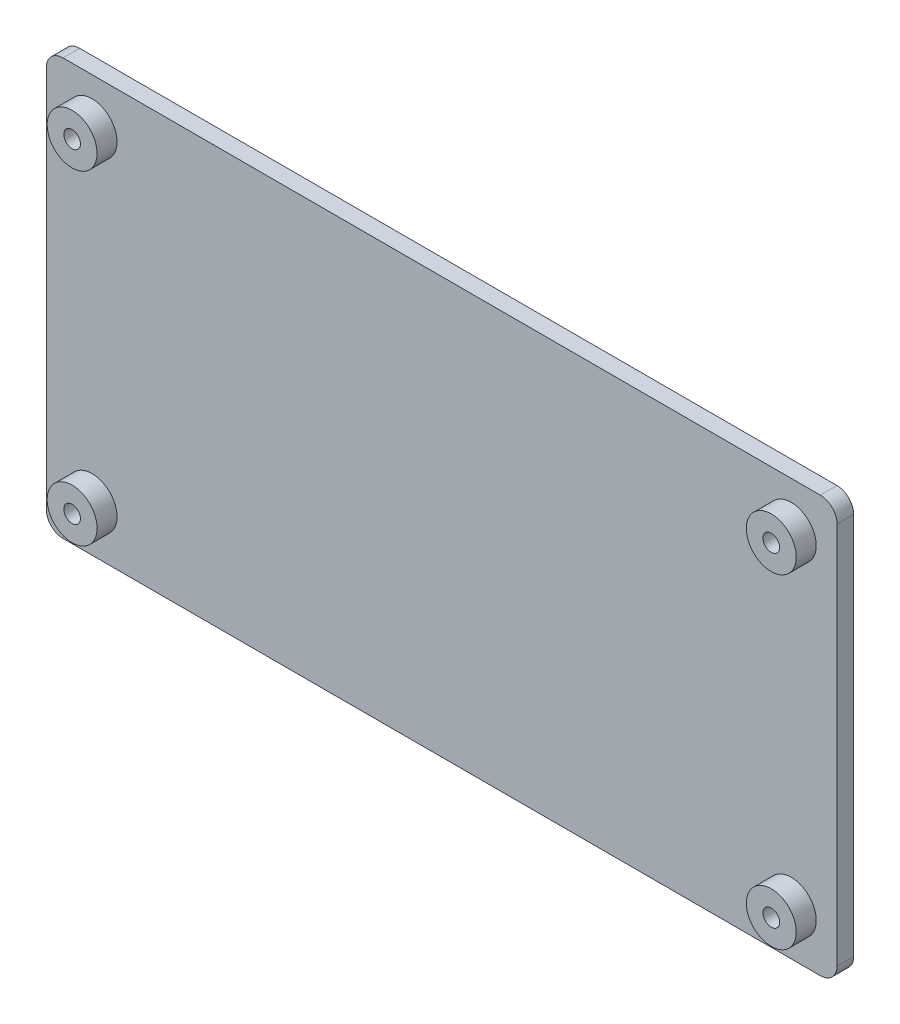
ISO-10303-21;
HEADER;
FILE_DESCRIPTION(('STEP AP214'),'2;1');
FILE_NAME('part.step','',(''),(''),'','','');
FILE_SCHEMA(('AUTOMOTIVE_DESIGN { 1 0 10303 214 1 1 1 1 }'));
ENDSEC;
DATA;
#1=APPLICATION_CONTEXT('core data for automotive mechanical design processes');
#2=APPLICATION_PROTOCOL_DEFINITION('international standard','automotive_design',2000,#1);
#3=PRODUCT_CONTEXT('',#1,'mechanical');
#4=PRODUCT('Part','Part','',(#3));
#5=PRODUCT_RELATED_PRODUCT_CATEGORY('part','',(#4));
#6=PRODUCT_DEFINITION_FORMATION('','',#4);
#7=PRODUCT_DEFINITION_CONTEXT('part definition',#1,'design');
#8=PRODUCT_DEFINITION('design','',#6,#7);
#9=PRODUCT_DEFINITION_SHAPE('','',#8);
#10=(LENGTH_UNIT() NAMED_UNIT(*) SI_UNIT(.MILLI.,.METRE.));
#11=(NAMED_UNIT(*) PLANE_ANGLE_UNIT() SI_UNIT($,.RADIAN.));
#12=(NAMED_UNIT(*) SI_UNIT($,.STERADIAN.) SOLID_ANGLE_UNIT());
#13=UNCERTAINTY_MEASURE_WITH_UNIT(LENGTH_MEASURE(1.E-05),#10,'distance_accuracy_value','');
#14=(GEOMETRIC_REPRESENTATION_CONTEXT(3) GLOBAL_UNCERTAINTY_ASSIGNED_CONTEXT((#13)) GLOBAL_UNIT_ASSIGNED_CONTEXT((#10,
#11,#12)) REPRESENTATION_CONTEXT('',''));
#15=CARTESIAN_POINT('',(0.,0.,0.));
#16=DIRECTION('',(0.,0.,1.));
#17=DIRECTION('',(1.,0.,0.));
#18=AXIS2_PLACEMENT_3D('',#15,#16,#17);
#19=CARTESIAN_POINT('',(47.5,-25.,2.));
#20=DIRECTION('',(-1.,0.,0.));
#21=DIRECTION('',(0.,0.,1.));
#22=AXIS2_PLACEMENT_3D('',#19,#20,#21);
#23=PLANE('',#22);
#24=DIRECTION('',(0.,1.,0.));
#25=VECTOR('',#24,1.);
#26=CARTESIAN_POINT('',(47.5,-25.,2.));
#27=LINE('',#26,#25);
#28=CARTESIAN_POINT('',(47.5,-23.,2.));
#29=VERTEX_POINT('',#28);
#30=CARTESIAN_POINT('',(47.5,23.,2.));
#31=VERTEX_POINT('',#30);
#32=EDGE_CURVE('E134',#29,#31,#27,.T.);
#33=ORIENTED_EDGE('',*,*,#32,.F.);
#34=DIRECTION('',(0.,0.,-1.));
#35=VECTOR('',#34,1.);
#36=CARTESIAN_POINT('',(47.5,-23.,2.));
#37=LINE('',#36,#35);
#38=CARTESIAN_POINT('',(47.5,-23.,0.));
#39=VERTEX_POINT('',#38);
#40=EDGE_CURVE('E114',#29,#39,#37,.T.);
#41=ORIENTED_EDGE('',*,*,#40,.T.);
#42=DIRECTION('',(0.,1.,0.));
#43=VECTOR('',#42,1.);
#44=CARTESIAN_POINT('',(47.5,-25.,0.));
#45=LINE('',#44,#43);
#46=CARTESIAN_POINT('',(47.5,23.,0.));
#47=VERTEX_POINT('',#46);
#48=EDGE_CURVE('E129',#39,#47,#45,.T.);
#49=ORIENTED_EDGE('',*,*,#48,.T.);
#50=DIRECTION('',(0.,0.,-1.));
#51=VECTOR('',#50,1.);
#52=CARTESIAN_POINT('',(47.5,23.,2.));
#53=LINE('',#52,#51);
#54=EDGE_CURVE('E133',#47,#31,#53,.F.);
#55=ORIENTED_EDGE('',*,*,#54,.T.);
#56=EDGE_LOOP('',(#33,#41,#49,#55));
#57=FACE_BOUND('',#56,.T.);
#58=ADVANCED_FACE('F44',(#57),#23,.F.);
#59=CARTESIAN_POINT('',(-47.5,25.,2.));
#60=DIRECTION('',(0.,-1.,0.));
#61=DIRECTION('',(1.,0.,0.));
#62=AXIS2_PLACEMENT_3D('',#59,#60,#61);
#63=PLANE('',#62);
#64=DIRECTION('',(-1.,0.,0.));
#65=VECTOR('',#64,1.);
#66=CARTESIAN_POINT('',(-47.5,25.,2.));
#67=LINE('',#66,#65);
#68=CARTESIAN_POINT('',(45.5,25.,2.));
#69=VERTEX_POINT('',#68);
#70=CARTESIAN_POINT('',(-45.5,25.,2.));
#71=VERTEX_POINT('',#70);
#72=EDGE_CURVE('E224',#69,#71,#67,.T.);
#73=ORIENTED_EDGE('',*,*,#72,.F.);
#74=DIRECTION('',(0.,0.,-1.));
#75=VECTOR('',#74,1.);
#76=CARTESIAN_POINT('',(45.5,25.,2.));
#77=LINE('',#76,#75);
#78=CARTESIAN_POINT('',(45.5,25.,0.));
#79=VERTEX_POINT('',#78);
#80=EDGE_CURVE('E204',#69,#79,#77,.T.);
#81=ORIENTED_EDGE('',*,*,#80,.T.);
#82=DIRECTION('',(-1.,0.,0.));
#83=VECTOR('',#82,1.);
#84=CARTESIAN_POINT('',(-47.5,25.,0.));
#85=LINE('',#84,#83);
#86=CARTESIAN_POINT('',(-45.5,25.,0.));
#87=VERTEX_POINT('',#86);
#88=EDGE_CURVE('E138',#79,#87,#85,.T.);
#89=ORIENTED_EDGE('',*,*,#88,.T.);
#90=DIRECTION('',(0.,0.,-1.));
#91=VECTOR('',#90,1.);
#92=CARTESIAN_POINT('',(-45.5,25.,2.));
#93=LINE('',#92,#91);
#94=EDGE_CURVE('E205',#87,#71,#93,.F.);
#95=ORIENTED_EDGE('',*,*,#94,.T.);
#96=EDGE_LOOP('',(#73,#81,#89,#95));
#97=FACE_BOUND('',#96,.T.);
#98=ADVANCED_FACE('F323',(#97),#63,.F.);
#99=CARTESIAN_POINT('',(-47.5,-25.,2.));
#100=DIRECTION('',(1.,0.,0.));
#101=DIRECTION('',(0.,1.,0.));
#102=AXIS2_PLACEMENT_3D('',#99,#100,#101);
#103=PLANE('',#102);
#104=DIRECTION('',(0.,-1.,0.));
#105=VECTOR('',#104,1.);
#106=CARTESIAN_POINT('',(-47.5,-25.,0.));
#107=LINE('',#106,#105);
#108=CARTESIAN_POINT('',(-47.5,23.,0.));
#109=VERTEX_POINT('',#108);
#110=CARTESIAN_POINT('',(-47.5,-23.,0.));
#111=VERTEX_POINT('',#110);
#112=EDGE_CURVE('E143',#109,#111,#107,.T.);
#113=ORIENTED_EDGE('',*,*,#112,.T.);
#114=DIRECTION('',(0.,0.,-1.));
#115=VECTOR('',#114,1.);
#116=CARTESIAN_POINT('',(-47.5,-23.,2.));
#117=LINE('',#116,#115);
#118=CARTESIAN_POINT('',(-47.5,-23.,2.));
#119=VERTEX_POINT('',#118);
#120=EDGE_CURVE('E11',#111,#119,#117,.F.);
#121=ORIENTED_EDGE('',*,*,#120,.T.);
#122=DIRECTION('',(0.,-1.,0.));
#123=VECTOR('',#122,1.);
#124=CARTESIAN_POINT('',(-47.5,-25.,2.));
#125=LINE('',#124,#123);
#126=CARTESIAN_POINT('',(-47.5,23.,2.));
#127=VERTEX_POINT('',#126);
#128=EDGE_CURVE('E214',#127,#119,#125,.T.);
#129=ORIENTED_EDGE('',*,*,#128,.F.);
#130=DIRECTION('',(0.,0.,-1.));
#131=VECTOR('',#130,1.);
#132=CARTESIAN_POINT('',(-47.5,23.,2.));
#133=LINE('',#132,#131);
#134=EDGE_CURVE('E53',#127,#109,#133,.T.);
#135=ORIENTED_EDGE('',*,*,#134,.T.);
#136=EDGE_LOOP('',(#113,#121,#129,#135));
#137=FACE_BOUND('',#136,.T.);
#138=ADVANCED_FACE('F215',(#137),#103,.F.);
#139=CARTESIAN_POINT('',(-47.5,-25.,2.));
#140=DIRECTION('',(0.,1.,0.));
#141=DIRECTION('',(-1.,0.,0.));
#142=AXIS2_PLACEMENT_3D('',#139,#140,#141);
#143=PLANE('',#142);
#144=DIRECTION('',(1.,0.,0.));
#145=VECTOR('',#144,1.);
#146=CARTESIAN_POINT('',(-47.5,-25.,0.));
#147=LINE('',#146,#145);
#148=CARTESIAN_POINT('',(-45.5,-25.,0.));
#149=VERTEX_POINT('',#148);
#150=CARTESIAN_POINT('',(45.5,-25.,0.));
#151=VERTEX_POINT('',#150);
#152=EDGE_CURVE('E156',#149,#151,#147,.T.);
#153=ORIENTED_EDGE('',*,*,#152,.T.);
#154=DIRECTION('',(0.,0.,-1.));
#155=VECTOR('',#154,1.);
#156=CARTESIAN_POINT('',(45.5,-25.,2.));
#157=LINE('',#156,#155);
#158=CARTESIAN_POINT('',(45.5,-25.,2.));
#159=VERTEX_POINT('',#158);
#160=EDGE_CURVE('E116',#151,#159,#157,.F.);
#161=ORIENTED_EDGE('',*,*,#160,.T.);
#162=DIRECTION('',(1.,0.,0.));
#163=VECTOR('',#162,1.);
#164=CARTESIAN_POINT('',(-47.5,-25.,2.));
#165=LINE('',#164,#163);
#166=CARTESIAN_POINT('',(-45.5,-25.,2.));
#167=VERTEX_POINT('',#166);
#168=EDGE_CURVE('E154',#167,#159,#165,.T.);
#169=ORIENTED_EDGE('',*,*,#168,.F.);
#170=DIRECTION('',(0.,0.,-1.));
#171=VECTOR('',#170,1.);
#172=CARTESIAN_POINT('',(-45.5,-25.,2.));
#173=LINE('',#172,#171);
#174=EDGE_CURVE('E125',#167,#149,#173,.T.);
#175=ORIENTED_EDGE('',*,*,#174,.T.);
#176=EDGE_LOOP('',(#153,#161,#169,#175));
#177=FACE_BOUND('',#176,.T.);
#178=ADVANCED_FACE('F221',(#177),#143,.F.);
#179=CARTESIAN_POINT('',(0.,0.,2.));
#180=DIRECTION('',(0.,0.,-1.));
#181=DIRECTION('',(-1.,0.,0.));
#182=AXIS2_PLACEMENT_3D('',#179,#180,#181);
#183=PLANE('',#182);
#184=CARTESIAN_POINT('',(42.0000000000002,-19.4999999999997,2.));
#185=DIRECTION('',(0.,0.,-1.));
#186=DIRECTION('',(-1.,0.,0.));
#187=AXIS2_PLACEMENT_3D('',#184,#185,#186);
#188=CIRCLE('',#187,3.);
#189=CARTESIAN_POINT('',(39.0000000000002,-19.4999999999997,2.));
#190=VERTEX_POINT('',#189);
#191=EDGE_CURVE('E237',#190,#190,#188,.T.);
#192=ORIENTED_EDGE('',*,*,#191,.T.);
#193=EDGE_LOOP('',(#192));
#194=FACE_BOUND('',#193,.T.);
#195=CARTESIAN_POINT('',(-42.0002133604268,-19.4999999999997,2.));
#196=DIRECTION('',(0.,0.,-1.));
#197=DIRECTION('',(-1.,0.,0.));
#198=AXIS2_PLACEMENT_3D('',#195,#196,#197);
#199=CIRCLE('',#198,2.99999999999992);
#200=CARTESIAN_POINT('',(-45.0002133604268,-19.4999999999997,2.));
#201=VERTEX_POINT('',#200);
#202=EDGE_CURVE('E247',#201,#201,#199,.T.);
#203=ORIENTED_EDGE('',*,*,#202,.T.);
#204=EDGE_LOOP('',(#203));
#205=FACE_BOUND('',#204,.T.);
#206=CARTESIAN_POINT('',(-42.0002133604268,19.5000990601983,2.));
#207=DIRECTION('',(0.,0.,-1.));
#208=DIRECTION('',(-1.,0.,0.));
#209=AXIS2_PLACEMENT_3D('',#206,#207,#208);
#210=CIRCLE('',#209,3.);
#211=CARTESIAN_POINT('',(-45.0002133604268,19.5000990601983,2.));
#212=VERTEX_POINT('',#211);
#213=EDGE_CURVE('E231',#212,#212,#210,.T.);
#214=ORIENTED_EDGE('',*,*,#213,.T.);
#215=EDGE_LOOP('',(#214));
#216=FACE_BOUND('',#215,.T.);
#217=CARTESIAN_POINT('',(42.0000000000001,19.5000990601983,2.));
#218=DIRECTION('',(0.,0.,-1.));
#219=DIRECTION('',(-1.,0.,0.));
#220=AXIS2_PLACEMENT_3D('',#217,#218,#219);
#221=CIRCLE('',#220,2.99999999999993);
#222=CARTESIAN_POINT('',(39.0000000000002,19.5000990601983,2.));
#223=VERTEX_POINT('',#222);
#224=EDGE_CURVE('E149',#223,#223,#221,.T.);
#225=ORIENTED_EDGE('',*,*,#224,.T.);
#226=EDGE_LOOP('',(#225));
#227=FACE_BOUND('',#226,.T.);
#228=ORIENTED_EDGE('',*,*,#168,.T.);
#229=CARTESIAN_POINT('',(45.5,-23.,2.));
#230=DIRECTION('',(0.,0.,-1.));
#231=DIRECTION('',(-1.,0.,0.));
#232=AXIS2_PLACEMENT_3D('',#229,#230,#231);
#233=CIRCLE('',#232,2.);
#234=EDGE_CURVE('E198',#159,#29,#233,.F.);
#235=ORIENTED_EDGE('',*,*,#234,.T.);
#236=ORIENTED_EDGE('',*,*,#32,.T.);
#237=CARTESIAN_POINT('',(45.5,23.,2.));
#238=DIRECTION('',(0.,0.,-1.));
#239=DIRECTION('',(-1.,0.,0.));
#240=AXIS2_PLACEMENT_3D('',#237,#238,#239);
#241=CIRCLE('',#240,2.);
#242=EDGE_CURVE('E199',#31,#69,#241,.F.);
#243=ORIENTED_EDGE('',*,*,#242,.T.);
#244=ORIENTED_EDGE('',*,*,#72,.T.);
#245=CARTESIAN_POINT('',(-45.5,23.,2.));
#246=DIRECTION('',(0.,0.,-1.));
#247=DIRECTION('',(-1.,0.,0.));
#248=AXIS2_PLACEMENT_3D('',#245,#246,#247);
#249=CIRCLE('',#248,2.);
#250=EDGE_CURVE('E69',#71,#127,#249,.F.);
#251=ORIENTED_EDGE('',*,*,#250,.T.);
#252=ORIENTED_EDGE('',*,*,#128,.T.);
#253=CARTESIAN_POINT('',(-45.5,-23.,2.));
#254=DIRECTION('',(0.,0.,-1.));
#255=DIRECTION('',(-1.,0.,0.));
#256=AXIS2_PLACEMENT_3D('',#253,#254,#255);
#257=CIRCLE('',#256,2.);
#258=EDGE_CURVE('E194',#119,#167,#257,.F.);
#259=ORIENTED_EDGE('',*,*,#258,.T.);
#260=EDGE_LOOP('',(#228,#235,#236,#243,#244,#251,#252,#259));
#261=FACE_BOUND('',#260,.T.);
#262=ADVANCED_FACE('F348',(#194,#205,#216,#227,#261),#183,.F.);
#263=CARTESIAN_POINT('',(0.,0.,0.));
#264=DIRECTION('',(0.,0.,-1.));
#265=DIRECTION('',(-1.,0.,0.));
#266=AXIS2_PLACEMENT_3D('',#263,#264,#265);
#267=PLANE('',#266);
#268=CARTESIAN_POINT('',(42.0000000000002,-19.4999999999997,0.));
#269=DIRECTION('',(0.,0.,-1.));
#270=DIRECTION('',(-1.,0.,0.));
#271=AXIS2_PLACEMENT_3D('',#268,#269,#270);
#272=CIRCLE('',#271,2.);
#273=CARTESIAN_POINT('',(40.0000000000002,-19.4999999999997,0.));
#274=VERTEX_POINT('',#273);
#275=EDGE_CURVE('E265',#274,#274,#272,.T.);
#276=ORIENTED_EDGE('',*,*,#275,.F.);
#277=EDGE_LOOP('',(#276));
#278=FACE_BOUND('',#277,.T.);
#279=CARTESIAN_POINT('',(-42.0002133604268,19.5000990601983,0.));
#280=DIRECTION('',(0.,0.,-1.));
#281=DIRECTION('',(-1.,0.,0.));
#282=AXIS2_PLACEMENT_3D('',#279,#280,#281);
#283=CIRCLE('',#282,2.);
#284=CARTESIAN_POINT('',(-44.0002133604268,19.5000990601983,0.));
#285=VERTEX_POINT('',#284);
#286=EDGE_CURVE('E272',#285,#285,#283,.T.);
#287=ORIENTED_EDGE('',*,*,#286,.F.);
#288=EDGE_LOOP('',(#287));
#289=FACE_BOUND('',#288,.T.);
#290=CARTESIAN_POINT('',(-42.0002133604268,-19.4999999999997,0.));
#291=DIRECTION('',(0.,0.,-1.));
#292=DIRECTION('',(-1.,0.,0.));
#293=AXIS2_PLACEMENT_3D('',#290,#291,#292);
#294=CIRCLE('',#293,2.);
#295=CARTESIAN_POINT('',(-44.0002133604268,-19.4999999999997,0.));
#296=VERTEX_POINT('',#295);
#297=EDGE_CURVE('E275',#296,#296,#294,.T.);
#298=ORIENTED_EDGE('',*,*,#297,.F.);
#299=EDGE_LOOP('',(#298));
#300=FACE_BOUND('',#299,.T.);
#301=CARTESIAN_POINT('',(42.0000000000002,19.5000990601983,0.));
#302=DIRECTION('',(0.,0.,-1.));
#303=DIRECTION('',(-1.,0.,0.));
#304=AXIS2_PLACEMENT_3D('',#301,#302,#303);
#305=CIRCLE('',#304,2.);
#306=CARTESIAN_POINT('',(40.0000000000002,19.5000990601983,0.));
#307=VERTEX_POINT('',#306);
#308=EDGE_CURVE('E256',#307,#307,#305,.T.);
#309=ORIENTED_EDGE('',*,*,#308,.F.);
#310=EDGE_LOOP('',(#309));
#311=FACE_BOUND('',#310,.T.);
#312=ORIENTED_EDGE('',*,*,#48,.F.);
#313=CARTESIAN_POINT('',(45.5,-23.,0.));
#314=DIRECTION('',(0.,0.,-1.));
#315=DIRECTION('',(-1.,0.,0.));
#316=AXIS2_PLACEMENT_3D('',#313,#314,#315);
#317=CIRCLE('',#316,2.);
#318=EDGE_CURVE('E111',#39,#151,#317,.T.);
#319=ORIENTED_EDGE('',*,*,#318,.T.);
#320=ORIENTED_EDGE('',*,*,#152,.F.);
#321=CARTESIAN_POINT('',(-45.5,-23.,0.));
#322=DIRECTION('',(0.,0.,-1.));
#323=DIRECTION('',(-1.,0.,0.));
#324=AXIS2_PLACEMENT_3D('',#321,#322,#323);
#325=CIRCLE('',#324,2.);
#326=EDGE_CURVE('E181',#149,#111,#325,.T.);
#327=ORIENTED_EDGE('',*,*,#326,.T.);
#328=ORIENTED_EDGE('',*,*,#112,.F.);
#329=CARTESIAN_POINT('',(-45.5,23.,0.));
#330=DIRECTION('',(0.,0.,-1.));
#331=DIRECTION('',(-1.,0.,0.));
#332=AXIS2_PLACEMENT_3D('',#329,#330,#331);
#333=CIRCLE('',#332,2.);
#334=EDGE_CURVE('E135',#109,#87,#333,.T.);
#335=ORIENTED_EDGE('',*,*,#334,.T.);
#336=ORIENTED_EDGE('',*,*,#88,.F.);
#337=CARTESIAN_POINT('',(45.5,23.,0.));
#338=DIRECTION('',(0.,0.,-1.));
#339=DIRECTION('',(-1.,0.,0.));
#340=AXIS2_PLACEMENT_3D('',#337,#338,#339);
#341=CIRCLE('',#340,2.);
#342=EDGE_CURVE('E124',#79,#47,#341,.T.);
#343=ORIENTED_EDGE('',*,*,#342,.T.);
#344=EDGE_LOOP('',(#312,#319,#320,#327,#328,#335,#336,#343));
#345=FACE_BOUND('',#344,.T.);
#346=ADVANCED_FACE('F136',(#278,#289,#300,#311,#345),#267,.T.);
#347=CARTESIAN_POINT('',(42.0000000000001,19.5000990601983,4.4));
#348=DIRECTION('',(0.,0.,-1.));
#349=DIRECTION('',(-1.,0.,0.));
#350=AXIS2_PLACEMENT_3D('',#347,#348,#349);
#351=CYLINDRICAL_SURFACE('',#350,2.99999999999993);
#352=CARTESIAN_POINT('',(42.0000000000001,19.5000990601983,4.4));
#353=DIRECTION('',(0.,0.,-1.));
#354=DIRECTION('',(-1.,0.,0.));
#355=AXIS2_PLACEMENT_3D('',#352,#353,#354);
#356=CIRCLE('',#355,2.99999999999993);
#357=CARTESIAN_POINT('',(39.0000000000002,19.5000990601983,4.4));
#358=VERTEX_POINT('',#357);
#359=EDGE_CURVE('E139',#358,#358,#356,.T.);
#360=ORIENTED_EDGE('',*,*,#359,.T.);
#361=EDGE_LOOP('',(#360));
#362=FACE_BOUND('',#361,.T.);
#363=ORIENTED_EDGE('',*,*,#224,.F.);
#364=EDGE_LOOP('',(#363));
#365=FACE_BOUND('',#364,.T.);
#366=ADVANCED_FACE('F356',(#362,#365),#351,.T.);
#367=CARTESIAN_POINT('',(42.0000000000001,19.5000990601983,4.4));
#368=DIRECTION('',(0.,0.,-1.));
#369=DIRECTION('',(-1.,0.,0.));
#370=AXIS2_PLACEMENT_3D('',#367,#368,#369);
#371=PLANE('',#370);
#372=CARTESIAN_POINT('',(42.0000000000002,19.5000990601983,4.4));
#373=DIRECTION('',(0.,0.,-1.));
#374=DIRECTION('',(-1.,0.,0.));
#375=AXIS2_PLACEMENT_3D('',#372,#373,#374);
#376=CIRCLE('',#375,0.999999999999998);
#377=CARTESIAN_POINT('',(41.0000000000002,19.5000990601983,4.4));
#378=VERTEX_POINT('',#377);
#379=EDGE_CURVE('E165',#378,#378,#376,.T.);
#380=ORIENTED_EDGE('',*,*,#379,.T.);
#381=EDGE_LOOP('',(#380));
#382=FACE_BOUND('',#381,.T.);
#383=ORIENTED_EDGE('',*,*,#359,.F.);
#384=EDGE_LOOP('',(#383));
#385=FACE_BOUND('',#384,.T.);
#386=ADVANCED_FACE('F392',(#382,#385),#371,.F.);
#387=CARTESIAN_POINT('',(-42.0002133604268,19.5000990601983,4.4));
#388=DIRECTION('',(0.,0.,-1.));
#389=DIRECTION('',(-1.,0.,0.));
#390=AXIS2_PLACEMENT_3D('',#387,#388,#389);
#391=CYLINDRICAL_SURFACE('',#390,3.);
#392=CARTESIAN_POINT('',(-42.0002133604268,19.5000990601983,4.4));
#393=DIRECTION('',(0.,0.,-1.));
#394=DIRECTION('',(-1.,0.,0.));
#395=AXIS2_PLACEMENT_3D('',#392,#393,#394);
#396=CIRCLE('',#395,3.);
#397=CARTESIAN_POINT('',(-45.0002133604268,19.5000990601983,4.4));
#398=VERTEX_POINT('',#397);
#399=EDGE_CURVE('E255',#398,#398,#396,.T.);
#400=ORIENTED_EDGE('',*,*,#399,.T.);
#401=EDGE_LOOP('',(#400));
#402=FACE_BOUND('',#401,.T.);
#403=ORIENTED_EDGE('',*,*,#213,.F.);
#404=EDGE_LOOP('',(#403));
#405=FACE_BOUND('',#404,.T.);
#406=ADVANCED_FACE('F403',(#402,#405),#391,.T.);
#407=CARTESIAN_POINT('',(-42.0002133604268,19.5000990601983,4.4));
#408=DIRECTION('',(0.,0.,-1.));
#409=DIRECTION('',(-1.,0.,0.));
#410=AXIS2_PLACEMENT_3D('',#407,#408,#409);
#411=PLANE('',#410);
#412=CARTESIAN_POINT('',(-42.0002133604268,19.5000990601983,4.4));
#413=DIRECTION('',(0.,0.,-1.));
#414=DIRECTION('',(-1.,0.,0.));
#415=AXIS2_PLACEMENT_3D('',#412,#413,#414);
#416=CIRCLE('',#415,0.999999999999998);
#417=CARTESIAN_POINT('',(-43.0002133604268,19.5000990601983,4.4));
#418=VERTEX_POINT('',#417);
#419=EDGE_CURVE('E292',#418,#418,#416,.T.);
#420=ORIENTED_EDGE('',*,*,#419,.T.);
#421=EDGE_LOOP('',(#420));
#422=FACE_BOUND('',#421,.T.);
#423=ORIENTED_EDGE('',*,*,#399,.F.);
#424=EDGE_LOOP('',(#423));
#425=FACE_BOUND('',#424,.T.);
#426=ADVANCED_FACE('F304',(#422,#425),#411,.F.);
#427=CARTESIAN_POINT('',(-42.0002133604268,-19.4999999999997,4.4));
#428=DIRECTION('',(0.,0.,-1.));
#429=DIRECTION('',(-1.,0.,0.));
#430=AXIS2_PLACEMENT_3D('',#427,#428,#429);
#431=CYLINDRICAL_SURFACE('',#430,2.99999999999992);
#432=CARTESIAN_POINT('',(-42.0002133604268,-19.4999999999997,4.4));
#433=DIRECTION('',(0.,0.,-1.));
#434=DIRECTION('',(-1.,0.,0.));
#435=AXIS2_PLACEMENT_3D('',#432,#433,#434);
#436=CIRCLE('',#435,2.99999999999992);
#437=CARTESIAN_POINT('',(-45.0002133604268,-19.4999999999997,4.4));
#438=VERTEX_POINT('',#437);
#439=EDGE_CURVE('E242',#438,#438,#436,.T.);
#440=ORIENTED_EDGE('',*,*,#439,.T.);
#441=EDGE_LOOP('',(#440));
#442=FACE_BOUND('',#441,.T.);
#443=ORIENTED_EDGE('',*,*,#202,.F.);
#444=EDGE_LOOP('',(#443));
#445=FACE_BOUND('',#444,.T.);
#446=ADVANCED_FACE('F425',(#442,#445),#431,.T.);
#447=CARTESIAN_POINT('',(-42.0002133604268,-19.4999999999997,4.4));
#448=DIRECTION('',(0.,0.,-1.));
#449=DIRECTION('',(-1.,0.,0.));
#450=AXIS2_PLACEMENT_3D('',#447,#448,#449);
#451=PLANE('',#450);
#452=CARTESIAN_POINT('',(-42.0002133604268,-19.4999999999997,4.4));
#453=DIRECTION('',(0.,0.,-1.));
#454=DIRECTION('',(-1.,0.,0.));
#455=AXIS2_PLACEMENT_3D('',#452,#453,#454);
#456=CIRCLE('',#455,0.999999999999998);
#457=CARTESIAN_POINT('',(-43.0002133604268,-19.4999999999997,4.4));
#458=VERTEX_POINT('',#457);
#459=EDGE_CURVE('E300',#458,#458,#456,.T.);
#460=ORIENTED_EDGE('',*,*,#459,.T.);
#461=EDGE_LOOP('',(#460));
#462=FACE_BOUND('',#461,.T.);
#463=ORIENTED_EDGE('',*,*,#439,.F.);
#464=EDGE_LOOP('',(#463));
#465=FACE_BOUND('',#464,.T.);
#466=ADVANCED_FACE('F433',(#462,#465),#451,.F.);
#467=CARTESIAN_POINT('',(42.0000000000002,-19.4999999999997,4.4));
#468=DIRECTION('',(0.,0.,-1.));
#469=DIRECTION('',(-1.,0.,0.));
#470=AXIS2_PLACEMENT_3D('',#467,#468,#469);
#471=CYLINDRICAL_SURFACE('',#470,3.);
#472=CARTESIAN_POINT('',(42.0000000000002,-19.4999999999997,4.4));
#473=DIRECTION('',(0.,0.,-1.));
#474=DIRECTION('',(-1.,0.,0.));
#475=AXIS2_PLACEMENT_3D('',#472,#473,#474);
#476=CIRCLE('',#475,3.);
#477=CARTESIAN_POINT('',(39.0000000000002,-19.4999999999997,4.4));
#478=VERTEX_POINT('',#477);
#479=EDGE_CURVE('E232',#478,#478,#476,.T.);
#480=ORIENTED_EDGE('',*,*,#479,.T.);
#481=EDGE_LOOP('',(#480));
#482=FACE_BOUND('',#481,.T.);
#483=ORIENTED_EDGE('',*,*,#191,.F.);
#484=EDGE_LOOP('',(#483));
#485=FACE_BOUND('',#484,.T.);
#486=ADVANCED_FACE('F442',(#482,#485),#471,.T.);
#487=CARTESIAN_POINT('',(42.0000000000002,-19.4999999999997,4.4));
#488=DIRECTION('',(0.,0.,-1.));
#489=DIRECTION('',(-1.,0.,0.));
#490=AXIS2_PLACEMENT_3D('',#487,#488,#489);
#491=PLANE('',#490);
#492=CARTESIAN_POINT('',(42.0000000000002,-19.4999999999997,4.4));
#493=DIRECTION('',(0.,0.,-1.));
#494=DIRECTION('',(-1.,0.,0.));
#495=AXIS2_PLACEMENT_3D('',#492,#493,#494);
#496=CIRCLE('',#495,0.999999999999998);
#497=CARTESIAN_POINT('',(41.0000000000002,-19.4999999999997,4.4));
#498=VERTEX_POINT('',#497);
#499=EDGE_CURVE('E291',#498,#498,#496,.T.);
#500=ORIENTED_EDGE('',*,*,#499,.T.);
#501=EDGE_LOOP('',(#500));
#502=FACE_BOUND('',#501,.T.);
#503=ORIENTED_EDGE('',*,*,#479,.F.);
#504=EDGE_LOOP('',(#503));
#505=FACE_BOUND('',#504,.T.);
#506=ADVANCED_FACE('F454',(#502,#505),#491,.F.);
#507=CARTESIAN_POINT('',(42.0000000000002,19.5000990601983,1.5));
#508=DIRECTION('',(0.,0.,-1.));
#509=DIRECTION('',(-1.,0.,0.));
#510=AXIS2_PLACEMENT_3D('',#507,#508,#509);
#511=CYLINDRICAL_SURFACE('',#510,2.);
#512=CARTESIAN_POINT('',(42.0000000000002,19.5000990601983,1.5));
#513=DIRECTION('',(0.,0.,-1.));
#514=DIRECTION('',(-1.,0.,0.));
#515=AXIS2_PLACEMENT_3D('',#512,#513,#514);
#516=CIRCLE('',#515,2.);
#517=CARTESIAN_POINT('',(40.0000000000002,19.5000990601983,1.5));
#518=VERTEX_POINT('',#517);
#519=EDGE_CURVE('E239',#518,#518,#516,.T.);
#520=ORIENTED_EDGE('',*,*,#519,.F.);
#521=EDGE_LOOP('',(#520));
#522=FACE_BOUND('',#521,.T.);
#523=ORIENTED_EDGE('',*,*,#308,.T.);
#524=EDGE_LOOP('',(#523));
#525=FACE_BOUND('',#524,.T.);
#526=ADVANCED_FACE('F462',(#522,#525),#511,.F.);
#527=CARTESIAN_POINT('',(42.0000000000002,19.5000990601983,1.5));
#528=DIRECTION('',(0.,0.,-1.));
#529=DIRECTION('',(-1.,0.,0.));
#530=AXIS2_PLACEMENT_3D('',#527,#528,#529);
#531=PLANE('',#530);
#532=CARTESIAN_POINT('',(42.0000000000002,19.5000990601983,1.5));
#533=DIRECTION('',(0.,0.,-1.));
#534=DIRECTION('',(-1.,0.,0.));
#535=AXIS2_PLACEMENT_3D('',#532,#533,#534);
#536=CIRCLE('',#535,0.999999999999998);
#537=CARTESIAN_POINT('',(41.0000000000002,19.5000990601983,1.5));
#538=VERTEX_POINT('',#537);
#539=EDGE_CURVE('E175',#538,#538,#536,.T.);
#540=ORIENTED_EDGE('',*,*,#539,.F.);
#541=EDGE_LOOP('',(#540));
#542=FACE_BOUND('',#541,.T.);
#543=ORIENTED_EDGE('',*,*,#519,.T.);
#544=EDGE_LOOP('',(#543));
#545=FACE_BOUND('',#544,.T.);
#546=ADVANCED_FACE('F474',(#542,#545),#531,.T.);
#547=CARTESIAN_POINT('',(-42.0002133604268,-19.4999999999997,1.5));
#548=DIRECTION('',(0.,0.,-1.));
#549=DIRECTION('',(-1.,0.,0.));
#550=AXIS2_PLACEMENT_3D('',#547,#548,#549);
#551=CYLINDRICAL_SURFACE('',#550,2.);
#552=CARTESIAN_POINT('',(-42.0002133604268,-19.4999999999997,1.5));
#553=DIRECTION('',(0.,0.,-1.));
#554=DIRECTION('',(-1.,0.,0.));
#555=AXIS2_PLACEMENT_3D('',#552,#553,#554);
#556=CIRCLE('',#555,2.);
#557=CARTESIAN_POINT('',(-44.0002133604268,-19.4999999999997,1.5));
#558=VERTEX_POINT('',#557);
#559=EDGE_CURVE('E176',#558,#558,#556,.T.);
#560=ORIENTED_EDGE('',*,*,#559,.F.);
#561=EDGE_LOOP('',(#560));
#562=FACE_BOUND('',#561,.T.);
#563=ORIENTED_EDGE('',*,*,#297,.T.);
#564=EDGE_LOOP('',(#563));
#565=FACE_BOUND('',#564,.T.);
#566=ADVANCED_FACE('F482',(#562,#565),#551,.F.);
#567=CARTESIAN_POINT('',(-42.0002133604268,-19.4999999999997,1.5));
#568=DIRECTION('',(0.,0.,-1.));
#569=DIRECTION('',(-1.,0.,0.));
#570=AXIS2_PLACEMENT_3D('',#567,#568,#569);
#571=PLANE('',#570);
#572=CARTESIAN_POINT('',(-42.0002133604268,-19.4999999999997,1.5));
#573=DIRECTION('',(0.,0.,-1.));
#574=DIRECTION('',(-1.,0.,0.));
#575=AXIS2_PLACEMENT_3D('',#572,#573,#574);
#576=CIRCLE('',#575,0.999999999999998);
#577=CARTESIAN_POINT('',(-43.0002133604268,-19.4999999999997,1.5));
#578=VERTEX_POINT('',#577);
#579=EDGE_CURVE('E166',#578,#578,#576,.T.);
#580=ORIENTED_EDGE('',*,*,#579,.F.);
#581=EDGE_LOOP('',(#580));
#582=FACE_BOUND('',#581,.T.);
#583=ORIENTED_EDGE('',*,*,#559,.T.);
#584=EDGE_LOOP('',(#583));
#585=FACE_BOUND('',#584,.T.);
#586=ADVANCED_FACE('F491',(#582,#585),#571,.T.);
#587=CARTESIAN_POINT('',(-42.0002133604268,19.5000990601983,1.5));
#588=DIRECTION('',(0.,0.,-1.));
#589=DIRECTION('',(-1.,0.,0.));
#590=AXIS2_PLACEMENT_3D('',#587,#588,#589);
#591=CYLINDRICAL_SURFACE('',#590,2.);
#592=CARTESIAN_POINT('',(-42.0002133604268,19.5000990601983,1.5));
#593=DIRECTION('',(0.,0.,-1.));
#594=DIRECTION('',(-1.,0.,0.));
#595=AXIS2_PLACEMENT_3D('',#592,#593,#594);
#596=CIRCLE('',#595,2.);
#597=CARTESIAN_POINT('',(-44.0002133604268,19.5000990601983,1.5));
#598=VERTEX_POINT('',#597);
#599=EDGE_CURVE('E270',#598,#598,#596,.T.);
#600=ORIENTED_EDGE('',*,*,#599,.F.);
#601=EDGE_LOOP('',(#600));
#602=FACE_BOUND('',#601,.T.);
#603=ORIENTED_EDGE('',*,*,#286,.T.);
#604=EDGE_LOOP('',(#603));
#605=FACE_BOUND('',#604,.T.);
#606=ADVANCED_FACE('F503',(#602,#605),#591,.F.);
#607=CARTESIAN_POINT('',(-42.0002133604268,19.5000990601983,1.5));
#608=DIRECTION('',(0.,0.,-1.));
#609=DIRECTION('',(-1.,0.,0.));
#610=AXIS2_PLACEMENT_3D('',#607,#608,#609);
#611=PLANE('',#610);
#612=CARTESIAN_POINT('',(-42.0002133604268,19.5000990601983,1.5));
#613=DIRECTION('',(0.,0.,-1.));
#614=DIRECTION('',(-1.,0.,0.));
#615=AXIS2_PLACEMENT_3D('',#612,#613,#614);
#616=CIRCLE('',#615,0.999999999999998);
#617=CARTESIAN_POINT('',(-43.0002133604268,19.5000990601983,1.5));
#618=VERTEX_POINT('',#617);
#619=EDGE_CURVE('E161',#618,#618,#616,.T.);
#620=ORIENTED_EDGE('',*,*,#619,.F.);
#621=EDGE_LOOP('',(#620));
#622=FACE_BOUND('',#621,.T.);
#623=ORIENTED_EDGE('',*,*,#599,.T.);
#624=EDGE_LOOP('',(#623));
#625=FACE_BOUND('',#624,.T.);
#626=ADVANCED_FACE('F514',(#622,#625),#611,.T.);
#627=CARTESIAN_POINT('',(42.0000000000002,-19.4999999999997,1.5));
#628=DIRECTION('',(0.,0.,-1.));
#629=DIRECTION('',(-1.,0.,0.));
#630=AXIS2_PLACEMENT_3D('',#627,#628,#629);
#631=CYLINDRICAL_SURFACE('',#630,2.);
#632=CARTESIAN_POINT('',(42.0000000000002,-19.4999999999997,1.5));
#633=DIRECTION('',(0.,0.,-1.));
#634=DIRECTION('',(-1.,0.,0.));
#635=AXIS2_PLACEMENT_3D('',#632,#633,#634);
#636=CIRCLE('',#635,2.);
#637=CARTESIAN_POINT('',(40.0000000000002,-19.4999999999997,1.5));
#638=VERTEX_POINT('',#637);
#639=EDGE_CURVE('E277',#638,#638,#636,.T.);
#640=ORIENTED_EDGE('',*,*,#639,.F.);
#641=EDGE_LOOP('',(#640));
#642=FACE_BOUND('',#641,.T.);
#643=ORIENTED_EDGE('',*,*,#275,.T.);
#644=EDGE_LOOP('',(#643));
#645=FACE_BOUND('',#644,.T.);
#646=ADVANCED_FACE('F521',(#642,#645),#631,.F.);
#647=CARTESIAN_POINT('',(42.0000000000002,-19.4999999999997,1.5));
#648=DIRECTION('',(0.,0.,-1.));
#649=DIRECTION('',(-1.,0.,0.));
#650=AXIS2_PLACEMENT_3D('',#647,#648,#649);
#651=PLANE('',#650);
#652=CARTESIAN_POINT('',(42.0000000000002,-19.4999999999997,1.5));
#653=DIRECTION('',(0.,0.,-1.));
#654=DIRECTION('',(-1.,0.,0.));
#655=AXIS2_PLACEMENT_3D('',#652,#653,#654);
#656=CIRCLE('',#655,0.999999999999998);
#657=CARTESIAN_POINT('',(41.0000000000002,-19.4999999999997,1.5));
#658=VERTEX_POINT('',#657);
#659=EDGE_CURVE('E158',#658,#658,#656,.T.);
#660=ORIENTED_EDGE('',*,*,#659,.F.);
#661=EDGE_LOOP('',(#660));
#662=FACE_BOUND('',#661,.T.);
#663=ORIENTED_EDGE('',*,*,#639,.T.);
#664=EDGE_LOOP('',(#663));
#665=FACE_BOUND('',#664,.T.);
#666=ADVANCED_FACE('F322',(#662,#665),#651,.T.);
#667=CARTESIAN_POINT('',(42.0000000000002,-19.4999999999997,4.4));
#668=DIRECTION('',(0.,0.,-1.));
#669=DIRECTION('',(-1.,0.,0.));
#670=AXIS2_PLACEMENT_3D('',#667,#668,#669);
#671=CYLINDRICAL_SURFACE('',#670,0.999999999999998);
#672=ORIENTED_EDGE('',*,*,#659,.T.);
#673=EDGE_LOOP('',(#672));
#674=FACE_BOUND('',#673,.T.);
#675=ORIENTED_EDGE('',*,*,#499,.F.);
#676=EDGE_LOOP('',(#675));
#677=FACE_BOUND('',#676,.T.);
#678=ADVANCED_FACE('F311',(#674,#677),#671,.F.);
#679=CARTESIAN_POINT('',(-42.0002133604268,19.5000990601983,4.4));
#680=DIRECTION('',(0.,0.,-1.));
#681=DIRECTION('',(-1.,0.,0.));
#682=AXIS2_PLACEMENT_3D('',#679,#680,#681);
#683=CYLINDRICAL_SURFACE('',#682,0.999999999999998);
#684=ORIENTED_EDGE('',*,*,#619,.T.);
#685=EDGE_LOOP('',(#684));
#686=FACE_BOUND('',#685,.T.);
#687=ORIENTED_EDGE('',*,*,#419,.F.);
#688=EDGE_LOOP('',(#687));
#689=FACE_BOUND('',#688,.T.);
#690=ADVANCED_FACE('F308',(#686,#689),#683,.F.);
#691=CARTESIAN_POINT('',(-42.0002133604268,-19.4999999999997,4.4));
#692=DIRECTION('',(0.,0.,-1.));
#693=DIRECTION('',(-1.,0.,0.));
#694=AXIS2_PLACEMENT_3D('',#691,#692,#693);
#695=CYLINDRICAL_SURFACE('',#694,0.999999999999998);
#696=ORIENTED_EDGE('',*,*,#579,.T.);
#697=EDGE_LOOP('',(#696));
#698=FACE_BOUND('',#697,.T.);
#699=ORIENTED_EDGE('',*,*,#459,.F.);
#700=EDGE_LOOP('',(#699));
#701=FACE_BOUND('',#700,.T.);
#702=ADVANCED_FACE('F309',(#698,#701),#695,.F.);
#703=CARTESIAN_POINT('',(42.0000000000002,19.5000990601983,4.4));
#704=DIRECTION('',(0.,0.,-1.));
#705=DIRECTION('',(-1.,0.,0.));
#706=AXIS2_PLACEMENT_3D('',#703,#704,#705);
#707=CYLINDRICAL_SURFACE('',#706,0.999999999999998);
#708=ORIENTED_EDGE('',*,*,#539,.T.);
#709=EDGE_LOOP('',(#708));
#710=FACE_BOUND('',#709,.T.);
#711=ORIENTED_EDGE('',*,*,#379,.F.);
#712=EDGE_LOOP('',(#711));
#713=FACE_BOUND('',#712,.T.);
#714=ADVANCED_FACE('F319',(#710,#713),#707,.F.);
#715=CARTESIAN_POINT('',(45.5,-23.,2.));
#716=DIRECTION('',(0.,0.,-1.));
#717=DIRECTION('',(-1.,0.,0.));
#718=AXIS2_PLACEMENT_3D('',#715,#716,#717);
#719=CYLINDRICAL_SURFACE('',#718,2.);
#720=ORIENTED_EDGE('',*,*,#234,.F.);
#721=ORIENTED_EDGE('',*,*,#160,.F.);
#722=ORIENTED_EDGE('',*,*,#318,.F.);
#723=ORIENTED_EDGE('',*,*,#40,.F.);
#724=EDGE_LOOP('',(#720,#721,#722,#723));
#725=FACE_BOUND('',#724,.T.);
#726=ADVANCED_FACE('F112',(#725),#719,.T.);
#727=CARTESIAN_POINT('',(45.5,23.,2.));
#728=DIRECTION('',(0.,0.,-1.));
#729=DIRECTION('',(-1.,0.,0.));
#730=AXIS2_PLACEMENT_3D('',#727,#728,#729);
#731=CYLINDRICAL_SURFACE('',#730,2.);
#732=ORIENTED_EDGE('',*,*,#242,.F.);
#733=ORIENTED_EDGE('',*,*,#54,.F.);
#734=ORIENTED_EDGE('',*,*,#342,.F.);
#735=ORIENTED_EDGE('',*,*,#80,.F.);
#736=EDGE_LOOP('',(#732,#733,#734,#735));
#737=FACE_BOUND('',#736,.T.);
#738=ADVANCED_FACE('F340',(#737),#731,.T.);
#739=CARTESIAN_POINT('',(-45.5,-23.,2.));
#740=DIRECTION('',(0.,0.,-1.));
#741=DIRECTION('',(-1.,0.,0.));
#742=AXIS2_PLACEMENT_3D('',#739,#740,#741);
#743=CYLINDRICAL_SURFACE('',#742,2.);
#744=ORIENTED_EDGE('',*,*,#258,.F.);
#745=ORIENTED_EDGE('',*,*,#120,.F.);
#746=ORIENTED_EDGE('',*,*,#326,.F.);
#747=ORIENTED_EDGE('',*,*,#174,.F.);
#748=EDGE_LOOP('',(#744,#745,#746,#747));
#749=FACE_BOUND('',#748,.T.);
#750=ADVANCED_FACE('F220',(#749),#743,.T.);
#751=CARTESIAN_POINT('',(-45.5,23.,2.));
#752=DIRECTION('',(0.,0.,-1.));
#753=DIRECTION('',(-1.,0.,0.));
#754=AXIS2_PLACEMENT_3D('',#751,#752,#753);
#755=CYLINDRICAL_SURFACE('',#754,2.);
#756=ORIENTED_EDGE('',*,*,#250,.F.);
#757=ORIENTED_EDGE('',*,*,#94,.F.);
#758=ORIENTED_EDGE('',*,*,#334,.F.);
#759=ORIENTED_EDGE('',*,*,#134,.F.);
#760=EDGE_LOOP('',(#756,#757,#758,#759));
#761=FACE_BOUND('',#760,.T.);
#762=ADVANCED_FACE('F50',(#761),#755,.T.);
#763=CLOSED_SHELL('',(#58,#98,#138,#178,#262,#346,#366,#386,#406,#426,#446,#466,#486,#506,#526,
#546,#566,#586,#606,#626,#646,#666,#678,#690,#702,#714,#726,#738,#750,#762));
#764=MANIFOLD_SOLID_BREP('B2',#763);
#765=ADVANCED_BREP_SHAPE_REPRESENTATION('',(#18,#764),#14);
#766=SHAPE_DEFINITION_REPRESENTATION(#9,#765);
ENDSEC;
END-ISO-10303-21;
